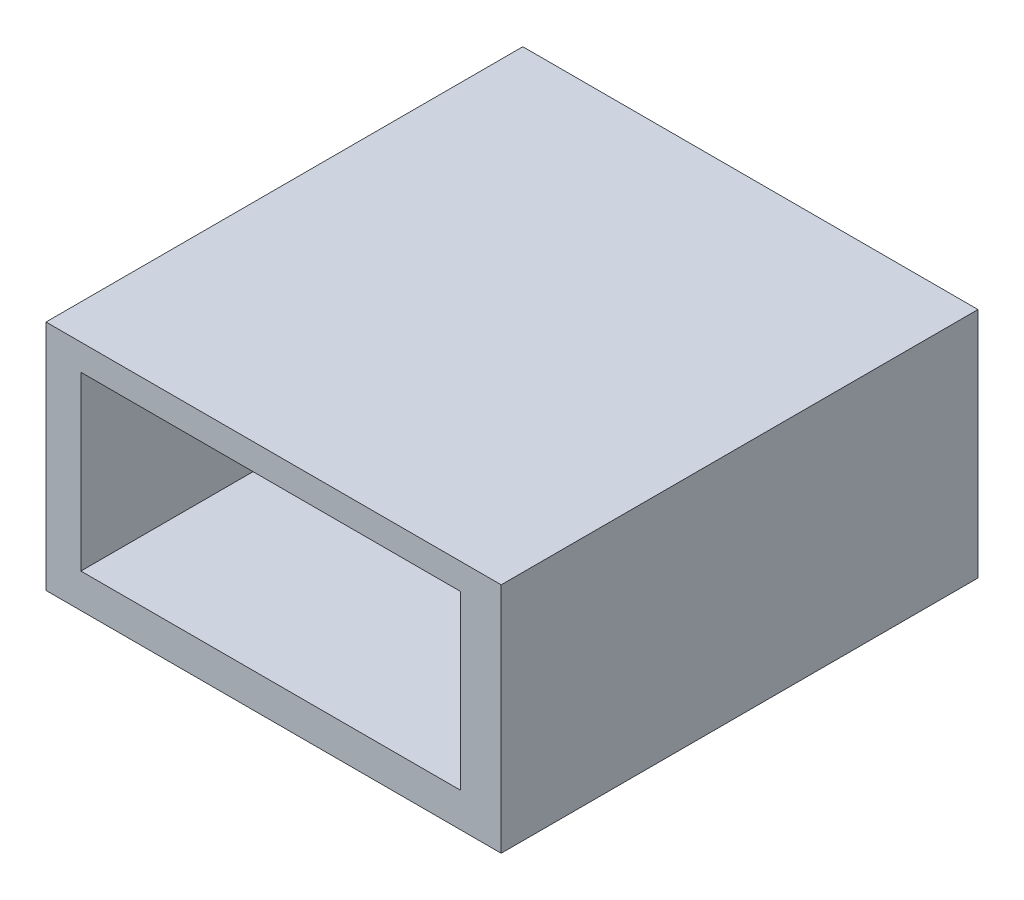
ISO-10303-21;
HEADER;
FILE_DESCRIPTION(('STEP AP214'),'2;1');
FILE_NAME('part.step','',(''),(''),'','','');
FILE_SCHEMA(('AUTOMOTIVE_DESIGN { 1 0 10303 214 1 1 1 1 }'));
ENDSEC;
DATA;
#1=APPLICATION_CONTEXT('core data for automotive mechanical design processes');
#2=APPLICATION_PROTOCOL_DEFINITION('international standard','automotive_design',2000,#1);
#3=PRODUCT_CONTEXT('',#1,'mechanical');
#4=PRODUCT('Part','Part','',(#3));
#5=PRODUCT_RELATED_PRODUCT_CATEGORY('part','',(#4));
#6=PRODUCT_DEFINITION_FORMATION('','',#4);
#7=PRODUCT_DEFINITION_CONTEXT('part definition',#1,'design');
#8=PRODUCT_DEFINITION('design','',#6,#7);
#9=PRODUCT_DEFINITION_SHAPE('','',#8);
#10=(LENGTH_UNIT() NAMED_UNIT(*) SI_UNIT(.MILLI.,.METRE.));
#11=(NAMED_UNIT(*) PLANE_ANGLE_UNIT() SI_UNIT($,.RADIAN.));
#12=(NAMED_UNIT(*) SI_UNIT($,.STERADIAN.) SOLID_ANGLE_UNIT());
#13=UNCERTAINTY_MEASURE_WITH_UNIT(LENGTH_MEASURE(1.E-05),#10,'distance_accuracy_value','');
#14=(GEOMETRIC_REPRESENTATION_CONTEXT(3) GLOBAL_UNCERTAINTY_ASSIGNED_CONTEXT((#13)) GLOBAL_UNIT_ASSIGNED_CONTEXT((#10,
#11,#12)) REPRESENTATION_CONTEXT('',''));
#15=CARTESIAN_POINT('',(0.,0.,0.));
#16=DIRECTION('',(0.,0.,1.));
#17=DIRECTION('',(1.,0.,0.));
#18=AXIS2_PLACEMENT_3D('',#15,#16,#17);
#19=CARTESIAN_POINT('',(70.397041573056,29.0173171362109,150.));
#20=DIRECTION('',(-1.,0.,0.));
#21=DIRECTION('',(0.,0.,1.));
#22=AXIS2_PLACEMENT_3D('',#19,#20,#21);
#23=PLANE('',#22);
#24=DIRECTION('',(0.,1.,0.));
#25=VECTOR('',#24,1.);
#26=CARTESIAN_POINT('',(70.397041573056,29.0173171362109,0.));
#27=LINE('',#26,#25);
#28=CARTESIAN_POINT('',(70.397041573056,-44.1269260592083,0.));
#29=VERTEX_POINT('',#28);
#30=CARTESIAN_POINT('',(70.397041573056,29.0173171362109,0.));
#31=VERTEX_POINT('',#30);
#32=EDGE_CURVE('E141',#29,#31,#27,.T.);
#33=ORIENTED_EDGE('',*,*,#32,.T.);
#34=DIRECTION('',(0.,0.,-1.));
#35=VECTOR('',#34,1.);
#36=CARTESIAN_POINT('',(70.397041573056,29.0173171362109,150.));
#37=LINE('',#36,#35);
#38=CARTESIAN_POINT('',(70.397041573056,29.0173171362109,150.));
#39=VERTEX_POINT('',#38);
#40=EDGE_CURVE('E11',#39,#31,#37,.T.);
#41=ORIENTED_EDGE('',*,*,#40,.F.);
#42=DIRECTION('',(0.,1.,0.));
#43=VECTOR('',#42,1.);
#44=CARTESIAN_POINT('',(70.397041573056,29.0173171362109,150.));
#45=LINE('',#44,#43);
#46=CARTESIAN_POINT('',(70.397041573056,-44.1269260592083,150.));
#47=VERTEX_POINT('',#46);
#48=EDGE_CURVE('E145',#47,#39,#45,.T.);
#49=ORIENTED_EDGE('',*,*,#48,.F.);
#50=DIRECTION('',(0.,0.,-1.));
#51=VECTOR('',#50,1.);
#52=CARTESIAN_POINT('',(70.397041573056,-44.1269260592083,150.));
#53=LINE('',#52,#51);
#54=EDGE_CURVE('E151',#47,#29,#53,.T.);
#55=ORIENTED_EDGE('',*,*,#54,.T.);
#56=EDGE_LOOP('',(#33,#41,#49,#55));
#57=FACE_BOUND('',#56,.T.);
#58=ADVANCED_FACE('F33',(#57),#23,.F.);
#59=CARTESIAN_POINT('',(70.397041573056,29.0173171362109,150.));
#60=DIRECTION('',(0.,-1.,0.));
#61=DIRECTION('',(0.,0.,-1.));
#62=AXIS2_PLACEMENT_3D('',#59,#60,#61);
#63=PLANE('',#62);
#64=DIRECTION('',(-1.,0.,0.));
#65=VECTOR('',#64,1.);
#66=CARTESIAN_POINT('',(70.397041573056,29.0173171362109,0.));
#67=LINE('',#66,#65);
#68=CARTESIAN_POINT('',(-72.8008429926238,29.0173171362109,0.));
#69=VERTEX_POINT('',#68);
#70=EDGE_CURVE('E154',#31,#69,#67,.T.);
#71=ORIENTED_EDGE('',*,*,#70,.T.);
#72=DIRECTION('',(0.,0.,-1.));
#73=VECTOR('',#72,1.);
#74=CARTESIAN_POINT('',(-72.8008429926238,29.0173171362109,150.));
#75=LINE('',#74,#73);
#76=CARTESIAN_POINT('',(-72.8008429926238,29.0173171362109,150.));
#77=VERTEX_POINT('',#76);
#78=EDGE_CURVE('E40',#77,#69,#75,.T.);
#79=ORIENTED_EDGE('',*,*,#78,.F.);
#80=DIRECTION('',(-1.,0.,0.));
#81=VECTOR('',#80,1.);
#82=CARTESIAN_POINT('',(70.397041573056,29.0173171362109,150.));
#83=LINE('',#82,#81);
#84=EDGE_CURVE('E84',#39,#77,#83,.T.);
#85=ORIENTED_EDGE('',*,*,#84,.F.);
#86=ORIENTED_EDGE('',*,*,#40,.T.);
#87=EDGE_LOOP('',(#71,#79,#85,#86));
#88=FACE_BOUND('',#87,.T.);
#89=ADVANCED_FACE('F183',(#88),#63,.F.);
#90=CARTESIAN_POINT('',(-72.8008429926238,29.0173171362109,150.));
#91=DIRECTION('',(1.,0.,0.));
#92=DIRECTION('',(0.,0.,-1.));
#93=AXIS2_PLACEMENT_3D('',#90,#91,#92);
#94=PLANE('',#93);
#95=DIRECTION('',(0.,-1.,0.));
#96=VECTOR('',#95,1.);
#97=CARTESIAN_POINT('',(-72.8008429926238,29.0173171362109,0.));
#98=LINE('',#97,#96);
#99=CARTESIAN_POINT('',(-72.8008429926238,-44.1269260592083,0.));
#100=VERTEX_POINT('',#99);
#101=EDGE_CURVE('E156',#69,#100,#98,.T.);
#102=ORIENTED_EDGE('',*,*,#101,.T.);
#103=DIRECTION('',(0.,0.,-1.));
#104=VECTOR('',#103,1.);
#105=CARTESIAN_POINT('',(-72.8008429926238,-44.1269260592083,150.));
#106=LINE('',#105,#104);
#107=CARTESIAN_POINT('',(-72.8008429926238,-44.1269260592083,150.));
#108=VERTEX_POINT('',#107);
#109=EDGE_CURVE('E160',#108,#100,#106,.T.);
#110=ORIENTED_EDGE('',*,*,#109,.F.);
#111=DIRECTION('',(0.,-1.,0.));
#112=VECTOR('',#111,1.);
#113=CARTESIAN_POINT('',(-72.8008429926238,29.0173171362109,150.));
#114=LINE('',#113,#112);
#115=EDGE_CURVE('E148',#77,#108,#114,.T.);
#116=ORIENTED_EDGE('',*,*,#115,.F.);
#117=ORIENTED_EDGE('',*,*,#78,.T.);
#118=EDGE_LOOP('',(#102,#110,#116,#117));
#119=FACE_BOUND('',#118,.T.);
#120=ADVANCED_FACE('F165',(#119),#94,.F.);
#121=CARTESIAN_POINT('',(70.397041573056,-44.1269260592083,150.));
#122=DIRECTION('',(0.,1.,0.));
#123=DIRECTION('',(0.,0.,1.));
#124=AXIS2_PLACEMENT_3D('',#121,#122,#123);
#125=PLANE('',#124);
#126=DIRECTION('',(1.,0.,0.));
#127=VECTOR('',#126,1.);
#128=CARTESIAN_POINT('',(70.397041573056,-44.1269260592083,0.));
#129=LINE('',#128,#127);
#130=EDGE_CURVE('E77',#100,#29,#129,.T.);
#131=ORIENTED_EDGE('',*,*,#130,.T.);
#132=ORIENTED_EDGE('',*,*,#54,.F.);
#133=DIRECTION('',(1.,0.,0.));
#134=VECTOR('',#133,1.);
#135=CARTESIAN_POINT('',(70.397041573056,-44.1269260592083,150.));
#136=LINE('',#135,#134);
#137=EDGE_CURVE('E56',#108,#47,#136,.T.);
#138=ORIENTED_EDGE('',*,*,#137,.F.);
#139=ORIENTED_EDGE('',*,*,#109,.T.);
#140=EDGE_LOOP('',(#131,#132,#138,#139));
#141=FACE_BOUND('',#140,.T.);
#142=ADVANCED_FACE('F173',(#141),#125,.F.);
#143=CARTESIAN_POINT('',(0.,0.,150.));
#144=DIRECTION('',(0.,0.,-1.));
#145=DIRECTION('',(-1.,0.,0.));
#146=AXIS2_PLACEMENT_3D('',#143,#144,#145);
#147=PLANE('',#146);
#148=DIRECTION('',(-1.,0.,0.));
#149=VECTOR('',#148,1.);
#150=CARTESIAN_POINT('',(57.6600612822528,20.8178878364684,150.));
#151=LINE('',#150,#149);
#152=CARTESIAN_POINT('',(57.6600612822528,20.8178878364684,150.));
#153=VERTEX_POINT('',#152);
#154=CARTESIAN_POINT('',(-61.8238549208516,20.8178878364684,150.));
#155=VERTEX_POINT('',#154);
#156=EDGE_CURVE('E135',#153,#155,#151,.T.);
#157=ORIENTED_EDGE('',*,*,#156,.F.);
#158=DIRECTION('',(0.,1.,0.));
#159=VECTOR('',#158,1.);
#160=CARTESIAN_POINT('',(57.6600612822528,20.8178878364684,150.));
#161=LINE('',#160,#159);
#162=CARTESIAN_POINT('',(57.6600612822528,-33.3507615714857,150.));
#163=VERTEX_POINT('',#162);
#164=EDGE_CURVE('E47',#163,#153,#161,.T.);
#165=ORIENTED_EDGE('',*,*,#164,.F.);
#166=DIRECTION('',(1.,0.,0.));
#167=VECTOR('',#166,1.);
#168=CARTESIAN_POINT('',(57.6600612822528,-33.3507615714857,150.));
#169=LINE('',#168,#167);
#170=CARTESIAN_POINT('',(-61.8238549208516,-33.3507615714857,150.));
#171=VERTEX_POINT('',#170);
#172=EDGE_CURVE('E126',#171,#163,#169,.T.);
#173=ORIENTED_EDGE('',*,*,#172,.F.);
#174=DIRECTION('',(0.,-1.,0.));
#175=VECTOR('',#174,1.);
#176=CARTESIAN_POINT('',(-61.8238549208516,20.8178878364684,150.));
#177=LINE('',#176,#175);
#178=EDGE_CURVE('E129',#155,#171,#177,.T.);
#179=ORIENTED_EDGE('',*,*,#178,.F.);
#180=EDGE_LOOP('',(#157,#165,#173,#179));
#181=FACE_BOUND('',#180,.T.);
#182=ORIENTED_EDGE('',*,*,#48,.T.);
#183=ORIENTED_EDGE('',*,*,#84,.T.);
#184=ORIENTED_EDGE('',*,*,#115,.T.);
#185=ORIENTED_EDGE('',*,*,#137,.T.);
#186=EDGE_LOOP('',(#182,#183,#184,#185));
#187=FACE_BOUND('',#186,.T.);
#188=ADVANCED_FACE('F175',(#181,#187),#147,.F.);
#189=CARTESIAN_POINT('',(0.,0.,0.));
#190=DIRECTION('',(0.,0.,-1.));
#191=DIRECTION('',(-1.,0.,0.));
#192=AXIS2_PLACEMENT_3D('',#189,#190,#191);
#193=PLANE('',#192);
#194=ORIENTED_EDGE('',*,*,#32,.F.);
#195=ORIENTED_EDGE('',*,*,#130,.F.);
#196=ORIENTED_EDGE('',*,*,#101,.F.);
#197=ORIENTED_EDGE('',*,*,#70,.F.);
#198=EDGE_LOOP('',(#194,#195,#196,#197));
#199=FACE_BOUND('',#198,.T.);
#200=ADVANCED_FACE('F169',(#199),#193,.T.);
#201=CARTESIAN_POINT('',(57.6600612822528,20.8178878364684,20.));
#202=DIRECTION('',(1.,0.,0.));
#203=DIRECTION('',(0.,1.,0.));
#204=AXIS2_PLACEMENT_3D('',#201,#202,#203);
#205=PLANE('',#204);
#206=ORIENTED_EDGE('',*,*,#164,.T.);
#207=DIRECTION('',(0.,0.,1.));
#208=VECTOR('',#207,1.);
#209=CARTESIAN_POINT('',(57.6600612822528,20.8178878364684,20.));
#210=LINE('',#209,#208);
#211=CARTESIAN_POINT('',(57.6600612822528,20.8178878364684,20.));
#212=VERTEX_POINT('',#211);
#213=EDGE_CURVE('E104',#212,#153,#210,.T.);
#214=ORIENTED_EDGE('',*,*,#213,.F.);
#215=DIRECTION('',(0.,1.,0.));
#216=VECTOR('',#215,1.);
#217=CARTESIAN_POINT('',(57.6600612822528,20.8178878364684,20.));
#218=LINE('',#217,#216);
#219=CARTESIAN_POINT('',(57.6600612822528,-33.3507615714857,20.));
#220=VERTEX_POINT('',#219);
#221=EDGE_CURVE('E108',#220,#212,#218,.T.);
#222=ORIENTED_EDGE('',*,*,#221,.F.);
#223=DIRECTION('',(0.,0.,1.));
#224=VECTOR('',#223,1.);
#225=CARTESIAN_POINT('',(57.6600612822528,-33.3507615714857,20.));
#226=LINE('',#225,#224);
#227=EDGE_CURVE('E139',#220,#163,#226,.T.);
#228=ORIENTED_EDGE('',*,*,#227,.T.);
#229=EDGE_LOOP('',(#206,#214,#222,#228));
#230=FACE_BOUND('',#229,.T.);
#231=ADVANCED_FACE('F106',(#230),#205,.F.);
#232=CARTESIAN_POINT('',(57.6600612822528,-33.3507615714857,20.));
#233=DIRECTION('',(0.,-1.,0.));
#234=DIRECTION('',(0.,0.,-1.));
#235=AXIS2_PLACEMENT_3D('',#232,#233,#234);
#236=PLANE('',#235);
#237=ORIENTED_EDGE('',*,*,#172,.T.);
#238=ORIENTED_EDGE('',*,*,#227,.F.);
#239=DIRECTION('',(1.,0.,0.));
#240=VECTOR('',#239,1.);
#241=CARTESIAN_POINT('',(57.6600612822528,-33.3507615714857,20.));
#242=LINE('',#241,#240);
#243=CARTESIAN_POINT('',(-61.8238549208516,-33.3507615714857,20.));
#244=VERTEX_POINT('',#243);
#245=EDGE_CURVE('E114',#244,#220,#242,.T.);
#246=ORIENTED_EDGE('',*,*,#245,.F.);
#247=DIRECTION('',(0.,0.,1.));
#248=VECTOR('',#247,1.);
#249=CARTESIAN_POINT('',(-61.8238549208516,-33.3507615714857,20.));
#250=LINE('',#249,#248);
#251=EDGE_CURVE('E142',#244,#171,#250,.T.);
#252=ORIENTED_EDGE('',*,*,#251,.T.);
#253=EDGE_LOOP('',(#237,#238,#246,#252));
#254=FACE_BOUND('',#253,.T.);
#255=ADVANCED_FACE('F222',(#254),#236,.F.);
#256=CARTESIAN_POINT('',(-61.8238549208516,20.8178878364684,20.));
#257=DIRECTION('',(-1.,0.,0.));
#258=DIRECTION('',(0.,0.,1.));
#259=AXIS2_PLACEMENT_3D('',#256,#257,#258);
#260=PLANE('',#259);
#261=ORIENTED_EDGE('',*,*,#178,.T.);
#262=ORIENTED_EDGE('',*,*,#251,.F.);
#263=DIRECTION('',(0.,-1.,0.));
#264=VECTOR('',#263,1.);
#265=CARTESIAN_POINT('',(-61.8238549208516,20.8178878364684,20.));
#266=LINE('',#265,#264);
#267=CARTESIAN_POINT('',(-61.8238549208516,20.8178878364684,20.));
#268=VERTEX_POINT('',#267);
#269=EDGE_CURVE('E122',#268,#244,#266,.T.);
#270=ORIENTED_EDGE('',*,*,#269,.F.);
#271=DIRECTION('',(0.,0.,1.));
#272=VECTOR('',#271,1.);
#273=CARTESIAN_POINT('',(-61.8238549208516,20.8178878364684,20.));
#274=LINE('',#273,#272);
#275=EDGE_CURVE('E113',#268,#155,#274,.T.);
#276=ORIENTED_EDGE('',*,*,#275,.T.);
#277=EDGE_LOOP('',(#261,#262,#270,#276));
#278=FACE_BOUND('',#277,.T.);
#279=ADVANCED_FACE('F231',(#278),#260,.F.);
#280=CARTESIAN_POINT('',(57.6600612822528,20.8178878364684,20.));
#281=DIRECTION('',(0.,1.,0.));
#282=DIRECTION('',(-1.,0.,0.));
#283=AXIS2_PLACEMENT_3D('',#280,#281,#282);
#284=PLANE('',#283);
#285=ORIENTED_EDGE('',*,*,#156,.T.);
#286=ORIENTED_EDGE('',*,*,#275,.F.);
#287=DIRECTION('',(-1.,0.,0.));
#288=VECTOR('',#287,1.);
#289=CARTESIAN_POINT('',(57.6600612822528,20.8178878364684,20.));
#290=LINE('',#289,#288);
#291=EDGE_CURVE('E117',#212,#268,#290,.T.);
#292=ORIENTED_EDGE('',*,*,#291,.F.);
#293=ORIENTED_EDGE('',*,*,#213,.T.);
#294=EDGE_LOOP('',(#285,#286,#292,#293));
#295=FACE_BOUND('',#294,.T.);
#296=ADVANCED_FACE('F118',(#295),#284,.F.);
#297=CARTESIAN_POINT('',(0.,0.,20.));
#298=DIRECTION('',(0.,0.,-1.));
#299=DIRECTION('',(-1.,0.,0.));
#300=AXIS2_PLACEMENT_3D('',#297,#298,#299);
#301=PLANE('',#300);
#302=ORIENTED_EDGE('',*,*,#221,.T.);
#303=ORIENTED_EDGE('',*,*,#291,.T.);
#304=ORIENTED_EDGE('',*,*,#269,.T.);
#305=ORIENTED_EDGE('',*,*,#245,.T.);
#306=EDGE_LOOP('',(#302,#303,#304,#305));
#307=FACE_BOUND('',#306,.T.);
#308=ADVANCED_FACE('F124',(#307),#301,.F.);
#309=CLOSED_SHELL('',(#58,#89,#120,#142,#188,#200,#231,#255,#279,#296,#308));
#310=MANIFOLD_SOLID_BREP('B2',#309);
#311=ADVANCED_BREP_SHAPE_REPRESENTATION('',(#18,#310),#14);
#312=SHAPE_DEFINITION_REPRESENTATION(#9,#311);
ENDSEC;
END-ISO-10303-21;
